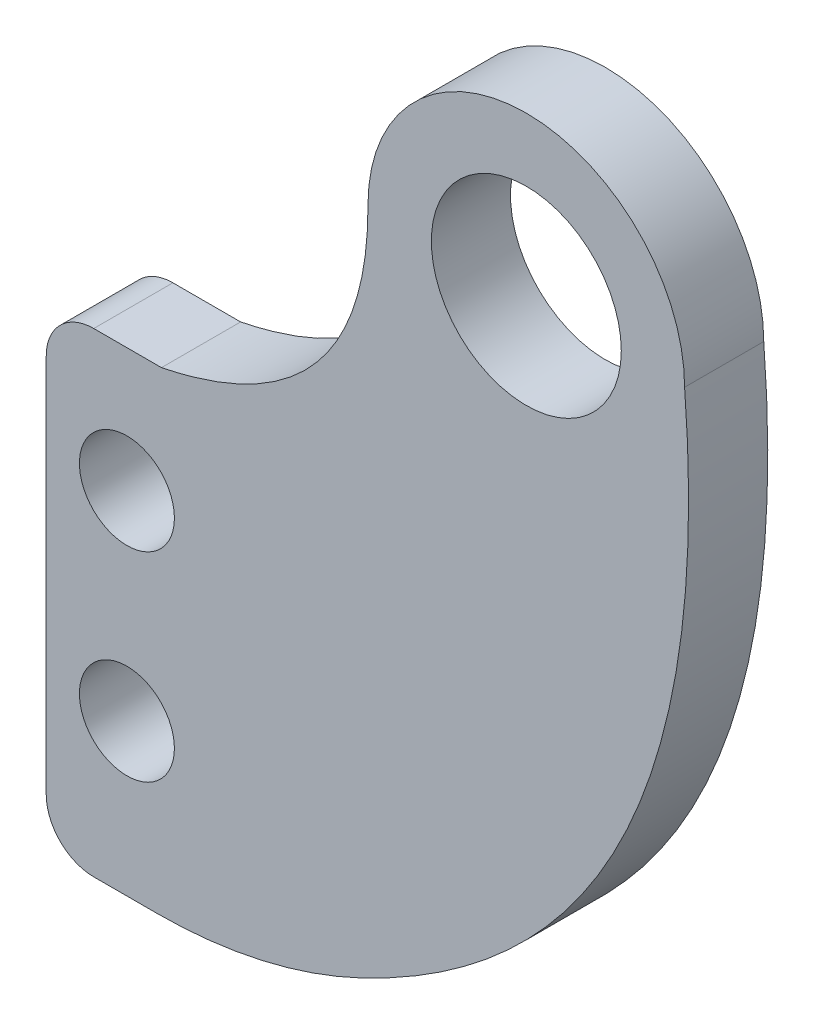
ISO-10303-21;
HEADER;
FILE_DESCRIPTION(('STEP AP214'),'2;1');
FILE_NAME('part.step','',(''),(''),'','','');
FILE_SCHEMA(('AUTOMOTIVE_DESIGN { 1 0 10303 214 1 1 1 1 }'));
ENDSEC;
DATA;
#1=APPLICATION_CONTEXT('core data for automotive mechanical design processes');
#2=APPLICATION_PROTOCOL_DEFINITION('international standard','automotive_design',2000,#1);
#3=PRODUCT_CONTEXT('',#1,'mechanical');
#4=PRODUCT('Part','Part','',(#3));
#5=PRODUCT_RELATED_PRODUCT_CATEGORY('part','',(#4));
#6=PRODUCT_DEFINITION_FORMATION('','',#4);
#7=PRODUCT_DEFINITION_CONTEXT('part definition',#1,'design');
#8=PRODUCT_DEFINITION('design','',#6,#7);
#9=PRODUCT_DEFINITION_SHAPE('','',#8);
#10=(LENGTH_UNIT() NAMED_UNIT(*) SI_UNIT(.MILLI.,.METRE.));
#11=(NAMED_UNIT(*) PLANE_ANGLE_UNIT() SI_UNIT($,.RADIAN.));
#12=(NAMED_UNIT(*) SI_UNIT($,.STERADIAN.) SOLID_ANGLE_UNIT());
#13=UNCERTAINTY_MEASURE_WITH_UNIT(LENGTH_MEASURE(1.E-05),#10,'distance_accuracy_value','');
#14=(GEOMETRIC_REPRESENTATION_CONTEXT(3) GLOBAL_UNCERTAINTY_ASSIGNED_CONTEXT((#13)) GLOBAL_UNIT_ASSIGNED_CONTEXT((#10,
#11,#12)) REPRESENTATION_CONTEXT('',''));
#15=CARTESIAN_POINT('',(0.,0.,0.));
#16=DIRECTION('',(0.,0.,1.));
#17=DIRECTION('',(1.,0.,0.));
#18=AXIS2_PLACEMENT_3D('',#15,#16,#17);
#19=CARTESIAN_POINT('',(688.352484273444,852.162985060315,5.));
#20=DIRECTION('',(0.,0.,-1.));
#21=DIRECTION('',(-1.,0.,0.));
#22=AXIS2_PLACEMENT_3D('',#19,#20,#21);
#23=CYLINDRICAL_SURFACE('',#22,3.);
#24=DIRECTION('',(0.,0.,1.));
#25=VECTOR('',#24,1.);
#26=CARTESIAN_POINT('',(685.352484273444,852.162985060315,5.));
#27=LINE('',#26,#25);
#28=CARTESIAN_POINT('',(685.352484273444,852.162985060315,0.));
#29=VERTEX_POINT('',#28);
#30=CARTESIAN_POINT('',(685.352484273444,852.162985060315,5.));
#31=VERTEX_POINT('',#30);
#32=EDGE_CURVE('E207',#29,#31,#27,.T.);
#33=ORIENTED_EDGE('',*,*,#32,.F.);
#34=CARTESIAN_POINT('',(688.352484273444,852.162985060315,0.));
#35=DIRECTION('',(0.,0.,1.));
#36=DIRECTION('',(1.,0.,0.));
#37=AXIS2_PLACEMENT_3D('',#34,#35,#36);
#38=CIRCLE('',#37,3.);
#39=CARTESIAN_POINT('',(688.352484273444,849.162985060315,0.));
#40=VERTEX_POINT('',#39);
#41=EDGE_CURVE('E48',#40,#29,#38,.F.);
#42=ORIENTED_EDGE('',*,*,#41,.F.);
#43=DIRECTION('',(0.,0.,1.));
#44=VECTOR('',#43,1.);
#45=CARTESIAN_POINT('',(688.352484273444,849.162985060315,5.));
#46=LINE('',#45,#44);
#47=CARTESIAN_POINT('',(688.352484273444,849.162985060315,5.));
#48=VERTEX_POINT('',#47);
#49=EDGE_CURVE('E210',#48,#40,#46,.F.);
#50=ORIENTED_EDGE('',*,*,#49,.F.);
#51=CARTESIAN_POINT('',(688.352484273444,852.162985060315,5.));
#52=DIRECTION('',(0.,0.,1.));
#53=DIRECTION('',(1.,0.,0.));
#54=AXIS2_PLACEMENT_3D('',#51,#52,#53);
#55=CIRCLE('',#54,3.);
#56=EDGE_CURVE('E11',#31,#48,#55,.T.);
#57=ORIENTED_EDGE('',*,*,#56,.F.);
#58=EDGE_LOOP('',(#33,#42,#50,#57));
#59=FACE_BOUND('',#58,.T.);
#60=ADVANCED_FACE('F41',(#59),#23,.T.);
#61=CARTESIAN_POINT('',(688.352484273444,876.162985060315,5.));
#62=DIRECTION('',(0.,0.,-1.));
#63=DIRECTION('',(-1.,0.,0.));
#64=AXIS2_PLACEMENT_3D('',#61,#62,#63);
#65=CYLINDRICAL_SURFACE('',#64,3.);
#66=DIRECTION('',(0.,0.,-1.));
#67=VECTOR('',#66,1.);
#68=CARTESIAN_POINT('',(685.352484273444,876.162985060315,5.));
#69=LINE('',#68,#67);
#70=CARTESIAN_POINT('',(685.352484273444,876.162985060315,5.));
#71=VERTEX_POINT('',#70);
#72=CARTESIAN_POINT('',(685.352484273444,876.162985060315,0.));
#73=VERTEX_POINT('',#72);
#74=EDGE_CURVE('E190',#71,#73,#69,.T.);
#75=ORIENTED_EDGE('',*,*,#74,.F.);
#76=CARTESIAN_POINT('',(688.352484273444,876.162985060315,5.));
#77=DIRECTION('',(0.,0.,1.));
#78=DIRECTION('',(1.,0.,0.));
#79=AXIS2_PLACEMENT_3D('',#76,#77,#78);
#80=CIRCLE('',#79,3.);
#81=CARTESIAN_POINT('',(688.352484273444,879.162985060315,5.));
#82=VERTEX_POINT('',#81);
#83=EDGE_CURVE('E193',#82,#71,#80,.T.);
#84=ORIENTED_EDGE('',*,*,#83,.F.);
#85=DIRECTION('',(0.,0.,-1.));
#86=VECTOR('',#85,1.);
#87=CARTESIAN_POINT('',(688.352484273444,879.162985060315,5.));
#88=LINE('',#87,#86);
#89=CARTESIAN_POINT('',(688.352484273444,879.162985060315,0.));
#90=VERTEX_POINT('',#89);
#91=EDGE_CURVE('E198',#90,#82,#88,.F.);
#92=ORIENTED_EDGE('',*,*,#91,.F.);
#93=CARTESIAN_POINT('',(688.352484273444,876.162985060315,0.));
#94=DIRECTION('',(0.,0.,1.));
#95=DIRECTION('',(1.,0.,0.));
#96=AXIS2_PLACEMENT_3D('',#93,#94,#95);
#97=CIRCLE('',#96,3.);
#98=EDGE_CURVE('E195',#73,#90,#97,.F.);
#99=ORIENTED_EDGE('',*,*,#98,.F.);
#100=EDGE_LOOP('',(#75,#84,#92,#99));
#101=FACE_BOUND('',#100,.T.);
#102=ADVANCED_FACE('F180',(#101),#65,.T.);
#103=CARTESIAN_POINT('',(692.346737865233,879.162985060315,0.));
#104=DIRECTION('',(0.,0.,-1.));
#105=DIRECTION('',(-1.,0.,0.));
#106=AXIS2_PLACEMENT_3D('',#103,#104,#105);
#107=CYLINDRICAL_SURFACE('',#106,30.);
#108=DIRECTION('',(0.,0.,-1.));
#109=VECTOR('',#108,1.);
#110=CARTESIAN_POINT('',(692.346737865233,849.162985060315,5.));
#111=LINE('',#110,#109);
#112=CARTESIAN_POINT('',(692.346737865233,849.162985060315,0.));
#113=VERTEX_POINT('',#112);
#114=CARTESIAN_POINT('',(692.346737865233,849.162985060315,5.));
#115=VERTEX_POINT('',#114);
#116=EDGE_CURVE('E127',#113,#115,#111,.F.);
#117=ORIENTED_EDGE('',*,*,#116,.F.);
#118=CARTESIAN_POINT('',(692.346737865233,879.162985060315,0.));
#119=DIRECTION('',(0.,0.,1.));
#120=DIRECTION('',(1.,0.,0.));
#121=AXIS2_PLACEMENT_3D('',#118,#119,#120);
#122=CIRCLE('',#121,30.);
#123=CARTESIAN_POINT('',(705.25628167117,852.082666031127,0.));
#124=VERTEX_POINT('',#123);
#125=EDGE_CURVE('E201',#124,#113,#122,.F.);
#126=ORIENTED_EDGE('',*,*,#125,.F.);
#127=DIRECTION('',(0.,0.,-1.));
#128=VECTOR('',#127,1.);
#129=CARTESIAN_POINT('',(705.25628167117,852.082666031127,5.));
#130=LINE('',#129,#128);
#131=CARTESIAN_POINT('',(705.25628167117,852.082666031127,5.));
#132=VERTEX_POINT('',#131);
#133=EDGE_CURVE('E234',#132,#124,#130,.T.);
#134=ORIENTED_EDGE('',*,*,#133,.F.);
#135=CARTESIAN_POINT('',(692.346737865233,879.162985060315,5.));
#136=DIRECTION('',(0.,0.,1.));
#137=DIRECTION('',(1.,0.,0.));
#138=AXIS2_PLACEMENT_3D('',#135,#136,#137);
#139=CIRCLE('',#138,30.);
#140=EDGE_CURVE('E114',#115,#132,#139,.T.);
#141=ORIENTED_EDGE('',*,*,#140,.F.);
#142=EDGE_LOOP('',(#117,#126,#134,#141));
#143=FACE_BOUND('',#142,.T.);
#144=ADVANCED_FACE('F164',(#143),#107,.T.);
#145=CARTESIAN_POINT('',(0.,849.162985060315,5.));
#146=DIRECTION('',(0.,1.,0.));
#147=DIRECTION('',(0.,0.,1.));
#148=AXIS2_PLACEMENT_3D('',#145,#146,#147);
#149=PLANE('',#148);
#150=DIRECTION('',(1.,0.,0.));
#151=VECTOR('',#150,1.);
#152=CARTESIAN_POINT('',(0.,849.162985060315,5.));
#153=LINE('',#152,#151);
#154=EDGE_CURVE('E118',#48,#115,#153,.T.);
#155=ORIENTED_EDGE('',*,*,#154,.F.);
#156=ORIENTED_EDGE('',*,*,#49,.T.);
#157=DIRECTION('',(1.,0.,0.));
#158=VECTOR('',#157,1.);
#159=CARTESIAN_POINT('',(0.,849.162985060315,0.));
#160=LINE('',#159,#158);
#161=EDGE_CURVE('E216',#40,#113,#160,.T.);
#162=ORIENTED_EDGE('',*,*,#161,.T.);
#163=ORIENTED_EDGE('',*,*,#116,.T.);
#164=EDGE_LOOP('',(#155,#156,#162,#163));
#165=FACE_BOUND('',#164,.T.);
#166=ADVANCED_FACE('F161',(#165),#149,.F.);
#167=CARTESIAN_POINT('',(697.448463408854,849.162985060315,5.));
#168=CARTESIAN_POINT('',(728.616221011109,858.088958630144,5.));
#169=CARTESIAN_POINT('',(725.678478781472,894.611707807184,5.));
#170=B_SPLINE_CURVE_WITH_KNOTS('',2,(#167,#168,#169),.UNSPECIFIED.,.F.,.F.,(3,3),(0.,1.),.UNSPECIFIED.);
#171=DIRECTION('',(0.,0.,-1.));
#172=VECTOR('',#171,1.);
#173=SURFACE_OF_LINEAR_EXTRUSION('',#170,#172);
#174=CARTESIAN_POINT('',(725.678478781472,894.611707807184,5.));
#175=VERTEX_POINT('',#174);
#176=EDGE_CURVE('E106',#132,#175,#170,.T.);
#177=ORIENTED_EDGE('',*,*,#176,.F.);
#178=ORIENTED_EDGE('',*,*,#133,.T.);
#179=CARTESIAN_POINT('',(697.448463408854,849.162985060315,0.));
#180=CARTESIAN_POINT('',(728.616221011109,858.088958630144,0.));
#181=CARTESIAN_POINT('',(725.678478781472,894.611707807184,0.));
#182=B_SPLINE_CURVE_WITH_KNOTS('',2,(#179,#180,#181),.UNSPECIFIED.,.F.,.F.,(3,3),(0.,1.),.UNSPECIFIED.);
#183=CARTESIAN_POINT('',(725.678478781472,894.611707807184,0.));
#184=VERTEX_POINT('',#183);
#185=EDGE_CURVE('E124',#124,#184,#182,.T.);
#186=ORIENTED_EDGE('',*,*,#185,.T.);
#187=DIRECTION('',(0.,0.,-1.));
#188=VECTOR('',#187,1.);
#189=CARTESIAN_POINT('',(725.678478781472,894.611707807184,5.));
#190=LINE('',#189,#188);
#191=EDGE_CURVE('E121',#175,#184,#190,.T.);
#192=ORIENTED_EDGE('',*,*,#191,.F.);
#193=EDGE_LOOP('',(#177,#178,#186,#192));
#194=FACE_BOUND('',#193,.T.);
#195=ADVANCED_FACE('F122',(#194),#173,.F.);
#196=CARTESIAN_POINT('',(715.678478781472,894.611707807184,5.));
#197=DIRECTION('',(0.,0.,-1.));
#198=DIRECTION('',(-1.,0.,0.));
#199=AXIS2_PLACEMENT_3D('',#196,#197,#198);
#200=CYLINDRICAL_SURFACE('',#199,9.99999999999994);
#201=CARTESIAN_POINT('',(715.678478781472,894.611707807184,0.));
#202=DIRECTION('',(0.,0.,1.));
#203=DIRECTION('',(1.,0.,0.));
#204=AXIS2_PLACEMENT_3D('',#201,#202,#203);
#205=CIRCLE('',#204,9.99999999999994);
#206=CARTESIAN_POINT('',(705.678478781472,894.611707807184,0.));
#207=VERTEX_POINT('',#206);
#208=EDGE_CURVE('E239',#184,#207,#205,.T.);
#209=ORIENTED_EDGE('',*,*,#208,.T.);
#210=DIRECTION('',(0.,0.,-1.));
#211=VECTOR('',#210,1.);
#212=CARTESIAN_POINT('',(705.678478781472,894.611707807184,5.));
#213=LINE('',#212,#211);
#214=CARTESIAN_POINT('',(705.678478781472,894.611707807184,5.));
#215=VERTEX_POINT('',#214);
#216=EDGE_CURVE('E128',#215,#207,#213,.T.);
#217=ORIENTED_EDGE('',*,*,#216,.F.);
#218=CARTESIAN_POINT('',(715.678478781472,894.611707807184,5.));
#219=DIRECTION('',(0.,0.,1.));
#220=DIRECTION('',(1.,0.,0.));
#221=AXIS2_PLACEMENT_3D('',#218,#219,#220);
#222=CIRCLE('',#221,9.99999999999994);
#223=EDGE_CURVE('E111',#175,#215,#222,.T.);
#224=ORIENTED_EDGE('',*,*,#223,.F.);
#225=ORIENTED_EDGE('',*,*,#191,.T.);
#226=EDGE_LOOP('',(#209,#217,#224,#225));
#227=FACE_BOUND('',#226,.T.);
#228=ADVANCED_FACE('F130',(#227),#200,.T.);
#229=CARTESIAN_POINT('',(705.678478781472,894.611707807184,5.));
#230=CARTESIAN_POINT('',(705.713033961131,881.814969549962,5.));
#231=CARTESIAN_POINT('',(692.631868046725,879.162985060315,5.));
#232=B_SPLINE_CURVE_WITH_KNOTS('',2,(#229,#230,#231),.UNSPECIFIED.,.F.,.F.,(3,3),(0.,1.),.UNSPECIFIED.);
#233=DIRECTION('',(0.,0.,-1.));
#234=VECTOR('',#233,1.);
#235=SURFACE_OF_LINEAR_EXTRUSION('',#232,#234);
#236=CARTESIAN_POINT('',(705.678478781472,894.611707807184,0.));
#237=CARTESIAN_POINT('',(705.713033961131,881.814969549962,0.));
#238=CARTESIAN_POINT('',(692.631868046725,879.162985060315,0.));
#239=B_SPLINE_CURVE_WITH_KNOTS('',2,(#236,#237,#238),.UNSPECIFIED.,.F.,.F.,(3,3),(0.,1.),.UNSPECIFIED.);
#240=CARTESIAN_POINT('',(692.631868046725,879.162985060315,0.));
#241=VERTEX_POINT('',#240);
#242=EDGE_CURVE('E223',#207,#241,#239,.T.);
#243=ORIENTED_EDGE('',*,*,#242,.T.);
#244=DIRECTION('',(0.,0.,-1.));
#245=VECTOR('',#244,1.);
#246=CARTESIAN_POINT('',(692.631868046725,879.162985060315,5.));
#247=LINE('',#246,#245);
#248=CARTESIAN_POINT('',(692.631868046725,879.162985060315,5.));
#249=VERTEX_POINT('',#248);
#250=EDGE_CURVE('E227',#249,#241,#247,.T.);
#251=ORIENTED_EDGE('',*,*,#250,.F.);
#252=EDGE_CURVE('E133',#215,#249,#232,.T.);
#253=ORIENTED_EDGE('',*,*,#252,.F.);
#254=ORIENTED_EDGE('',*,*,#216,.T.);
#255=EDGE_LOOP('',(#243,#251,#253,#254));
#256=FACE_BOUND('',#255,.T.);
#257=ADVANCED_FACE('F150',(#256),#235,.F.);
#258=CARTESIAN_POINT('',(0.,879.162985060315,5.));
#259=DIRECTION('',(0.,1.,0.));
#260=DIRECTION('',(0.,0.,1.));
#261=AXIS2_PLACEMENT_3D('',#258,#259,#260);
#262=PLANE('',#261);
#263=DIRECTION('',(1.,0.,0.));
#264=VECTOR('',#263,1.);
#265=CARTESIAN_POINT('',(0.,879.162985060315,0.));
#266=LINE('',#265,#264);
#267=EDGE_CURVE('E218',#90,#241,#266,.T.);
#268=ORIENTED_EDGE('',*,*,#267,.F.);
#269=ORIENTED_EDGE('',*,*,#91,.T.);
#270=DIRECTION('',(1.,0.,0.));
#271=VECTOR('',#270,1.);
#272=CARTESIAN_POINT('',(0.,879.162985060315,5.));
#273=LINE('',#272,#271);
#274=EDGE_CURVE('E135',#82,#249,#273,.T.);
#275=ORIENTED_EDGE('',*,*,#274,.T.);
#276=ORIENTED_EDGE('',*,*,#250,.T.);
#277=EDGE_LOOP('',(#268,#269,#275,#276));
#278=FACE_BOUND('',#277,.T.);
#279=ADVANCED_FACE('F154',(#278),#262,.T.);
#280=CARTESIAN_POINT('',(715.678478781472,894.611707807184,5.));
#281=DIRECTION('',(0.,0.,-1.));
#282=DIRECTION('',(-1.,0.,0.));
#283=AXIS2_PLACEMENT_3D('',#280,#281,#282);
#284=CYLINDRICAL_SURFACE('',#283,5.99999999999999);
#285=CARTESIAN_POINT('',(715.678478781472,894.611707807184,5.));
#286=DIRECTION('',(0.,0.,1.));
#287=DIRECTION('',(1.,0.,0.));
#288=AXIS2_PLACEMENT_3D('',#285,#286,#287);
#289=CIRCLE('',#288,5.99999999999999);
#290=CARTESIAN_POINT('',(721.678478781472,894.611707807184,5.));
#291=VERTEX_POINT('',#290);
#292=EDGE_CURVE('E427',#291,#291,#289,.T.);
#293=ORIENTED_EDGE('',*,*,#292,.T.);
#294=EDGE_LOOP('',(#293));
#295=FACE_BOUND('',#294,.T.);
#296=CARTESIAN_POINT('',(715.678478781472,894.611707807184,0.));
#297=DIRECTION('',(0.,0.,1.));
#298=DIRECTION('',(1.,0.,0.));
#299=AXIS2_PLACEMENT_3D('',#296,#297,#298);
#300=CIRCLE('',#299,5.99999999999999);
#301=CARTESIAN_POINT('',(721.678478781472,894.611707807184,0.));
#302=VERTEX_POINT('',#301);
#303=EDGE_CURVE('E237',#302,#302,#300,.T.);
#304=ORIENTED_EDGE('',*,*,#303,.F.);
#305=EDGE_LOOP('',(#304));
#306=FACE_BOUND('',#305,.T.);
#307=ADVANCED_FACE('F166',(#295,#306),#284,.F.);
#308=CARTESIAN_POINT('',(690.448463408854,871.339216262915,5.));
#309=DIRECTION('',(0.,0.,-1.));
#310=DIRECTION('',(-1.,0.,0.));
#311=AXIS2_PLACEMENT_3D('',#308,#309,#310);
#312=CYLINDRICAL_SURFACE('',#311,3.00000000000005);
#313=CARTESIAN_POINT('',(690.448463408854,871.339216262915,5.));
#314=DIRECTION('',(0.,0.,1.));
#315=DIRECTION('',(1.,0.,0.));
#316=AXIS2_PLACEMENT_3D('',#313,#314,#315);
#317=CIRCLE('',#316,3.00000000000005);
#318=CARTESIAN_POINT('',(693.448463408854,871.339216262915,5.));
#319=VERTEX_POINT('',#318);
#320=EDGE_CURVE('E221',#319,#319,#317,.T.);
#321=ORIENTED_EDGE('',*,*,#320,.T.);
#322=EDGE_LOOP('',(#321));
#323=FACE_BOUND('',#322,.T.);
#324=CARTESIAN_POINT('',(690.448463408854,871.339216262915,0.));
#325=DIRECTION('',(0.,0.,1.));
#326=DIRECTION('',(1.,0.,0.));
#327=AXIS2_PLACEMENT_3D('',#324,#325,#326);
#328=CIRCLE('',#327,3.00000000000005);
#329=CARTESIAN_POINT('',(693.448463408854,871.339216262915,0.));
#330=VERTEX_POINT('',#329);
#331=EDGE_CURVE('E242',#330,#330,#328,.T.);
#332=ORIENTED_EDGE('',*,*,#331,.F.);
#333=EDGE_LOOP('',(#332));
#334=FACE_BOUND('',#333,.T.);
#335=ADVANCED_FACE('F169',(#323,#334),#312,.F.);
#336=CARTESIAN_POINT('',(690.448463408854,858.739216262915,5.));
#337=DIRECTION('',(0.,0.,-1.));
#338=DIRECTION('',(-1.,0.,0.));
#339=AXIS2_PLACEMENT_3D('',#336,#337,#338);
#340=CYLINDRICAL_SURFACE('',#339,3.00000000000005);
#341=CARTESIAN_POINT('',(690.448463408854,858.739216262915,5.));
#342=DIRECTION('',(0.,0.,1.));
#343=DIRECTION('',(1.,0.,0.));
#344=AXIS2_PLACEMENT_3D('',#341,#342,#343);
#345=CIRCLE('',#344,3.00000000000005);
#346=CARTESIAN_POINT('',(693.448463408854,858.739216262915,5.));
#347=VERTEX_POINT('',#346);
#348=EDGE_CURVE('E217',#347,#347,#345,.T.);
#349=ORIENTED_EDGE('',*,*,#348,.T.);
#350=EDGE_LOOP('',(#349));
#351=FACE_BOUND('',#350,.T.);
#352=CARTESIAN_POINT('',(690.448463408854,858.739216262915,0.));
#353=DIRECTION('',(0.,0.,1.));
#354=DIRECTION('',(1.,0.,0.));
#355=AXIS2_PLACEMENT_3D('',#352,#353,#354);
#356=CIRCLE('',#355,3.00000000000005);
#357=CARTESIAN_POINT('',(693.448463408854,858.739216262915,0.));
#358=VERTEX_POINT('',#357);
#359=EDGE_CURVE('E263',#358,#358,#356,.T.);
#360=ORIENTED_EDGE('',*,*,#359,.F.);
#361=EDGE_LOOP('',(#360));
#362=FACE_BOUND('',#361,.T.);
#363=ADVANCED_FACE('F173',(#351,#362),#340,.F.);
#364=CARTESIAN_POINT('',(685.352484273444,0.,5.));
#365=DIRECTION('',(-1.,0.,0.));
#366=DIRECTION('',(0.,0.,1.));
#367=AXIS2_PLACEMENT_3D('',#364,#365,#366);
#368=PLANE('',#367);
#369=DIRECTION('',(0.,1.,0.));
#370=VECTOR('',#369,1.);
#371=CARTESIAN_POINT('',(685.352484273444,0.,0.));
#372=LINE('',#371,#370);
#373=EDGE_CURVE('E214',#29,#73,#372,.T.);
#374=ORIENTED_EDGE('',*,*,#373,.F.);
#375=ORIENTED_EDGE('',*,*,#32,.T.);
#376=DIRECTION('',(0.,1.,0.));
#377=VECTOR('',#376,1.);
#378=CARTESIAN_POINT('',(685.352484273444,0.,5.));
#379=LINE('',#378,#377);
#380=EDGE_CURVE('E230',#31,#71,#379,.T.);
#381=ORIENTED_EDGE('',*,*,#380,.T.);
#382=ORIENTED_EDGE('',*,*,#74,.T.);
#383=EDGE_LOOP('',(#374,#375,#381,#382));
#384=FACE_BOUND('',#383,.T.);
#385=ADVANCED_FACE('F177',(#384),#368,.T.);
#386=CARTESIAN_POINT('',(0.,0.,5.));
#387=DIRECTION('',(0.,0.,1.));
#388=DIRECTION('',(1.,0.,0.));
#389=AXIS2_PLACEMENT_3D('',#386,#387,#388);
#390=PLANE('',#389);
#391=ORIENTED_EDGE('',*,*,#348,.F.);
#392=EDGE_LOOP('',(#391));
#393=FACE_BOUND('',#392,.T.);
#394=ORIENTED_EDGE('',*,*,#320,.F.);
#395=EDGE_LOOP('',(#394));
#396=FACE_BOUND('',#395,.T.);
#397=ORIENTED_EDGE('',*,*,#292,.F.);
#398=EDGE_LOOP('',(#397));
#399=FACE_BOUND('',#398,.T.);
#400=ORIENTED_EDGE('',*,*,#380,.F.);
#401=ORIENTED_EDGE('',*,*,#56,.T.);
#402=ORIENTED_EDGE('',*,*,#154,.T.);
#403=ORIENTED_EDGE('',*,*,#140,.T.);
#404=ORIENTED_EDGE('',*,*,#176,.T.);
#405=ORIENTED_EDGE('',*,*,#223,.T.);
#406=ORIENTED_EDGE('',*,*,#252,.T.);
#407=ORIENTED_EDGE('',*,*,#274,.F.);
#408=ORIENTED_EDGE('',*,*,#83,.T.);
#409=EDGE_LOOP('',(#400,#401,#402,#403,#404,#405,#406,#407,#408));
#410=FACE_BOUND('',#409,.T.);
#411=ADVANCED_FACE('F108',(#393,#396,#399,#410),#390,.T.);
#412=CARTESIAN_POINT('',(0.,0.,0.));
#413=DIRECTION('',(0.,0.,1.));
#414=DIRECTION('',(1.,0.,0.));
#415=AXIS2_PLACEMENT_3D('',#412,#413,#414);
#416=PLANE('',#415);
#417=ORIENTED_EDGE('',*,*,#359,.T.);
#418=EDGE_LOOP('',(#417));
#419=FACE_BOUND('',#418,.T.);
#420=ORIENTED_EDGE('',*,*,#331,.T.);
#421=EDGE_LOOP('',(#420));
#422=FACE_BOUND('',#421,.T.);
#423=ORIENTED_EDGE('',*,*,#303,.T.);
#424=EDGE_LOOP('',(#423));
#425=FACE_BOUND('',#424,.T.);
#426=ORIENTED_EDGE('',*,*,#161,.F.);
#427=ORIENTED_EDGE('',*,*,#41,.T.);
#428=ORIENTED_EDGE('',*,*,#373,.T.);
#429=ORIENTED_EDGE('',*,*,#98,.T.);
#430=ORIENTED_EDGE('',*,*,#267,.T.);
#431=ORIENTED_EDGE('',*,*,#242,.F.);
#432=ORIENTED_EDGE('',*,*,#208,.F.);
#433=ORIENTED_EDGE('',*,*,#185,.F.);
#434=ORIENTED_EDGE('',*,*,#125,.T.);
#435=EDGE_LOOP('',(#426,#427,#428,#429,#430,#431,#432,#433,#434));
#436=FACE_BOUND('',#435,.T.);
#437=ADVANCED_FACE('F213',(#419,#422,#425,#436),#416,.F.);
#438=CLOSED_SHELL('',(#60,#102,#144,#166,#195,#228,#257,#279,#307,#335,#363,#385,#411,#437));
#439=MANIFOLD_SOLID_BREP('B2',#438);
#440=ADVANCED_BREP_SHAPE_REPRESENTATION('',(#18,#439),#14);
#441=SHAPE_DEFINITION_REPRESENTATION(#9,#440);
ENDSEC;
END-ISO-10303-21;
